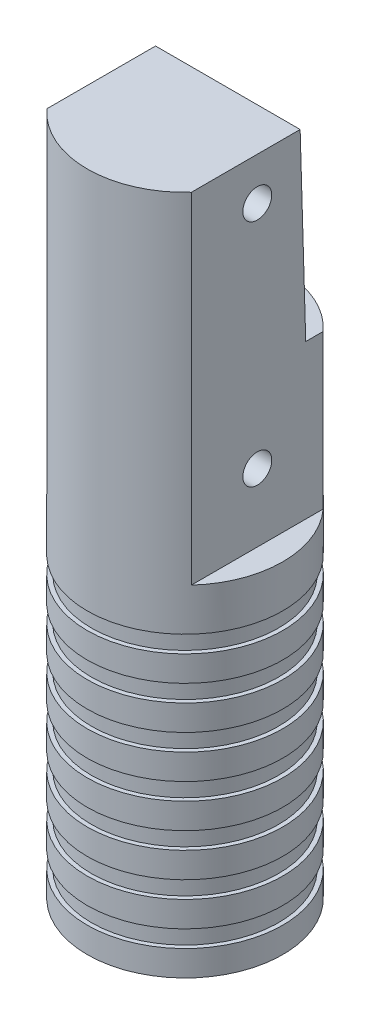
ISO-10303-21;
HEADER;
FILE_DESCRIPTION(('STEP AP214'),'2;1');
FILE_NAME('part.step','',(''),(''),'','','');
FILE_SCHEMA(('AUTOMOTIVE_DESIGN { 1 0 10303 214 1 1 1 1 }'));
ENDSEC;
DATA;
#1=APPLICATION_CONTEXT('core data for automotive mechanical design processes');
#2=APPLICATION_PROTOCOL_DEFINITION('international standard','automotive_design',2000,#1);
#3=PRODUCT_CONTEXT('',#1,'mechanical');
#4=PRODUCT('Part','Part','',(#3));
#5=PRODUCT_RELATED_PRODUCT_CATEGORY('part','',(#4));
#6=PRODUCT_DEFINITION_FORMATION('','',#4);
#7=PRODUCT_DEFINITION_CONTEXT('part definition',#1,'design');
#8=PRODUCT_DEFINITION('design','',#6,#7);
#9=PRODUCT_DEFINITION_SHAPE('','',#8);
#10=(LENGTH_UNIT() NAMED_UNIT(*) SI_UNIT(.MILLI.,.METRE.));
#11=(NAMED_UNIT(*) PLANE_ANGLE_UNIT() SI_UNIT($,.RADIAN.));
#12=(NAMED_UNIT(*) SI_UNIT($,.STERADIAN.) SOLID_ANGLE_UNIT());
#13=UNCERTAINTY_MEASURE_WITH_UNIT(LENGTH_MEASURE(1.E-05),#10,'distance_accuracy_value','');
#14=(GEOMETRIC_REPRESENTATION_CONTEXT(3) GLOBAL_UNCERTAINTY_ASSIGNED_CONTEXT((#13)) GLOBAL_UNIT_ASSIGNED_CONTEXT((#10,
#11,#12)) REPRESENTATION_CONTEXT('',''));
#15=CARTESIAN_POINT('',(0.,0.,0.));
#16=DIRECTION('',(0.,0.,1.));
#17=DIRECTION('',(1.,0.,0.));
#18=AXIS2_PLACEMENT_3D('',#15,#16,#17);
#19=CARTESIAN_POINT('',(8.5,40.,-7.74596669241483));
#20=DIRECTION('',(-1.,0.,0.));
#21=DIRECTION('',(0.,0.,1.));
#22=AXIS2_PLACEMENT_3D('',#19,#20,#21);
#23=PLANE('',#22);
#24=CARTESIAN_POINT('',(8.5,8.,0.));
#25=DIRECTION('',(1.,0.,0.));
#26=DIRECTION('',(0.,0.,-1.));
#27=AXIS2_PLACEMENT_3D('',#24,#25,#26);
#28=CIRCLE('',#27,1.69999999999999);
#29=CARTESIAN_POINT('',(8.5,8.,-1.69999999999999));
#30=VERTEX_POINT('',#29);
#31=EDGE_CURVE('E129',#30,#30,#28,.T.);
#32=ORIENTED_EDGE('',*,*,#31,.F.);
#33=EDGE_LOOP('',(#32));
#34=FACE_BOUND('',#33,.T.);
#35=DIRECTION('',(0.,-1.,0.));
#36=VECTOR('',#35,1.);
#37=CARTESIAN_POINT('',(8.5,40.,-7.74596669241483));
#38=LINE('',#37,#36);
#39=CARTESIAN_POINT('',(8.5,18.0816446814,-7.74596669241483));
#40=VERTEX_POINT('',#39);
#41=CARTESIAN_POINT('',(8.49999999999999,0.,-7.74596669241484));
#42=VERTEX_POINT('',#41);
#43=EDGE_CURVE('E156',#40,#42,#38,.T.);
#44=ORIENTED_EDGE('',*,*,#43,.F.);
#45=DIRECTION('',(0.,0.,1.));
#46=VECTOR('',#45,1.);
#47=CARTESIAN_POINT('',(8.5,18.0816446814,-7.74596669241483));
#48=LINE('',#47,#46);
#49=CARTESIAN_POINT('',(8.5,18.0816446814,-5.69544109983987));
#50=VERTEX_POINT('',#49);
#51=EDGE_CURVE('E127',#40,#50,#48,.T.);
#52=ORIENTED_EDGE('',*,*,#51,.T.);
#53=DIRECTION('',(0.,0.999550081494303,0.0299939091272407));
#54=VECTOR('',#53,1.);
#55=CARTESIAN_POINT('',(8.5,39.9188058826912,-5.04016445008036));
#56=LINE('',#55,#54);
#57=CARTESIAN_POINT('',(8.5,40.,-5.03772802491136));
#58=VERTEX_POINT('',#57);
#59=EDGE_CURVE('E117',#50,#58,#56,.T.);
#60=ORIENTED_EDGE('',*,*,#59,.T.);
#61=DIRECTION('',(0.,0.,-1.));
#62=VECTOR('',#61,1.);
#63=CARTESIAN_POINT('',(8.5,40.,-7.74596669241483));
#64=LINE('',#63,#62);
#65=CARTESIAN_POINT('',(8.5,40.,7.74596669241483));
#66=VERTEX_POINT('',#65);
#67=EDGE_CURVE('E153',#66,#58,#64,.T.);
#68=ORIENTED_EDGE('',*,*,#67,.F.);
#69=DIRECTION('',(0.,-1.,0.));
#70=VECTOR('',#69,1.);
#71=CARTESIAN_POINT('',(8.5,40.,7.74596669241483));
#72=LINE('',#71,#70);
#73=CARTESIAN_POINT('',(8.49999999999999,0.,7.74596669241484));
#74=VERTEX_POINT('',#73);
#75=EDGE_CURVE('E162',#66,#74,#72,.T.);
#76=ORIENTED_EDGE('',*,*,#75,.T.);
#77=DIRECTION('',(0.,0.,-1.));
#78=VECTOR('',#77,1.);
#79=CARTESIAN_POINT('',(8.5,0.,-7.74596669241483));
#80=LINE('',#79,#78);
#81=EDGE_CURVE('E151',#74,#42,#80,.T.);
#82=ORIENTED_EDGE('',*,*,#81,.T.);
#83=EDGE_LOOP('',(#44,#52,#60,#68,#76,#82));
#84=FACE_BOUND('',#83,.T.);
#85=CARTESIAN_POINT('',(8.5,35.,0.));
#86=DIRECTION('',(1.,0.,0.));
#87=DIRECTION('',(0.,0.,-1.));
#88=AXIS2_PLACEMENT_3D('',#85,#86,#87);
#89=CIRCLE('',#88,1.69999999999999);
#90=CARTESIAN_POINT('',(8.5,35.,-1.69999999999999));
#91=VERTEX_POINT('',#90);
#92=EDGE_CURVE('E135',#91,#91,#89,.T.);
#93=ORIENTED_EDGE('',*,*,#92,.F.);
#94=EDGE_LOOP('',(#93));
#95=FACE_BOUND('',#94,.T.);
#96=ADVANCED_FACE('F53',(#34,#84,#95),#23,.F.);
#97=CARTESIAN_POINT('',(0.,0.,0.));
#98=DIRECTION('',(0.,-1.,0.));
#99=DIRECTION('',(0.,0.,-1.));
#100=AXIS2_PLACEMENT_3D('',#97,#98,#99);
#101=PLANE('',#100);
#102=ORIENTED_EDGE('',*,*,#81,.F.);
#103=CARTESIAN_POINT('',(0.,0.,0.));
#104=DIRECTION('',(0.,1.,0.));
#105=DIRECTION('',(0.,0.,1.));
#106=AXIS2_PLACEMENT_3D('',#103,#104,#105);
#107=CIRCLE('',#106,11.5);
#108=EDGE_CURVE('E257',#74,#42,#107,.T.);
#109=ORIENTED_EDGE('',*,*,#108,.T.);
#110=EDGE_LOOP('',(#102,#109));
#111=FACE_BOUND('',#110,.T.);
#112=ADVANCED_FACE('F55',(#111),#101,.F.);
#113=DIRECTION('',(0.,0.,1.));
#114=VECTOR('',#113,1.);
#115=CARTESIAN_POINT('',(-8.5,0.,-7.74596669241483));
#116=LINE('',#115,#114);
#117=CARTESIAN_POINT('',(-8.49999999999999,0.,-7.74596669241484));
#118=VERTEX_POINT('',#117);
#119=CARTESIAN_POINT('',(-8.5,0.,7.74596669241483));
#120=VERTEX_POINT('',#119);
#121=EDGE_CURVE('E148',#118,#120,#116,.T.);
#122=ORIENTED_EDGE('',*,*,#121,.F.);
#123=EDGE_CURVE('E256',#118,#120,#107,.T.);
#124=ORIENTED_EDGE('',*,*,#123,.T.);
#125=EDGE_LOOP('',(#122,#124));
#126=FACE_BOUND('',#125,.T.);
#127=ADVANCED_FACE('F277',(#126),#101,.F.);
#128=CARTESIAN_POINT('',(0.,0.,0.));
#129=DIRECTION('',(0.,1.,0.));
#130=DIRECTION('',(0.,0.,1.));
#131=AXIS2_PLACEMENT_3D('',#128,#129,#130);
#132=CYLINDRICAL_SURFACE('',#131,11.5);
#133=CARTESIAN_POINT('',(0.,-7.,0.));
#134=DIRECTION('',(0.,1.,0.));
#135=DIRECTION('',(0.,0.,1.));
#136=AXIS2_PLACEMENT_3D('',#133,#134,#135);
#137=CIRCLE('',#136,11.5);
#138=CARTESIAN_POINT('',(0.,-7.,11.5));
#139=VERTEX_POINT('',#138);
#140=EDGE_CURVE('E178',#139,#139,#137,.T.);
#141=ORIENTED_EDGE('',*,*,#140,.F.);
#142=EDGE_LOOP('',(#141));
#143=FACE_BOUND('',#142,.T.);
#144=CARTESIAN_POINT('',(0.,-9.99999999999999,0.));
#145=DIRECTION('',(0.,1.,0.));
#146=DIRECTION('',(0.,0.,1.));
#147=AXIS2_PLACEMENT_3D('',#144,#145,#146);
#148=CIRCLE('',#147,11.5);
#149=CARTESIAN_POINT('',(0.,-9.99999999999999,11.5));
#150=VERTEX_POINT('',#149);
#151=EDGE_CURVE('E181',#150,#150,#148,.T.);
#152=ORIENTED_EDGE('',*,*,#151,.T.);
#153=EDGE_LOOP('',(#152));
#154=FACE_BOUND('',#153,.T.);
#155=ADVANCED_FACE('F282',(#143,#154),#132,.T.);
#156=CARTESIAN_POINT('',(0.,-12.,0.));
#157=DIRECTION('',(0.,1.,0.));
#158=DIRECTION('',(0.,0.,1.));
#159=AXIS2_PLACEMENT_3D('',#156,#157,#158);
#160=CIRCLE('',#159,11.5);
#161=CARTESIAN_POINT('',(0.,-12.,11.5));
#162=VERTEX_POINT('',#161);
#163=EDGE_CURVE('E190',#162,#162,#160,.T.);
#164=ORIENTED_EDGE('',*,*,#163,.F.);
#165=EDGE_LOOP('',(#164));
#166=FACE_BOUND('',#165,.T.);
#167=CARTESIAN_POINT('',(0.,-15.,0.));
#168=DIRECTION('',(0.,1.,0.));
#169=DIRECTION('',(0.,0.,1.));
#170=AXIS2_PLACEMENT_3D('',#167,#168,#169);
#171=CIRCLE('',#170,11.5);
#172=CARTESIAN_POINT('',(0.,-15.,11.5));
#173=VERTEX_POINT('',#172);
#174=EDGE_CURVE('E193',#173,#173,#171,.T.);
#175=ORIENTED_EDGE('',*,*,#174,.T.);
#176=EDGE_LOOP('',(#175));
#177=FACE_BOUND('',#176,.T.);
#178=ADVANCED_FACE('F390',(#166,#177),#132,.T.);
#179=CARTESIAN_POINT('',(0.,-17.,0.));
#180=DIRECTION('',(0.,1.,0.));
#181=DIRECTION('',(0.,0.,1.));
#182=AXIS2_PLACEMENT_3D('',#179,#180,#181);
#183=CIRCLE('',#182,11.5);
#184=CARTESIAN_POINT('',(0.,-17.,11.5));
#185=VERTEX_POINT('',#184);
#186=EDGE_CURVE('E202',#185,#185,#183,.T.);
#187=ORIENTED_EDGE('',*,*,#186,.F.);
#188=EDGE_LOOP('',(#187));
#189=FACE_BOUND('',#188,.T.);
#190=CARTESIAN_POINT('',(0.,-20.,0.));
#191=DIRECTION('',(0.,1.,0.));
#192=DIRECTION('',(0.,0.,1.));
#193=AXIS2_PLACEMENT_3D('',#190,#191,#192);
#194=CIRCLE('',#193,11.5);
#195=CARTESIAN_POINT('',(0.,-20.,11.5));
#196=VERTEX_POINT('',#195);
#197=EDGE_CURVE('E205',#196,#196,#194,.T.);
#198=ORIENTED_EDGE('',*,*,#197,.T.);
#199=EDGE_LOOP('',(#198));
#200=FACE_BOUND('',#199,.T.);
#201=ADVANCED_FACE('F422',(#189,#200),#132,.T.);
#202=CARTESIAN_POINT('',(0.,-22.,0.));
#203=DIRECTION('',(0.,1.,0.));
#204=DIRECTION('',(0.,0.,1.));
#205=AXIS2_PLACEMENT_3D('',#202,#203,#204);
#206=CIRCLE('',#205,11.5);
#207=CARTESIAN_POINT('',(0.,-22.,11.5));
#208=VERTEX_POINT('',#207);
#209=EDGE_CURVE('E214',#208,#208,#206,.T.);
#210=ORIENTED_EDGE('',*,*,#209,.F.);
#211=EDGE_LOOP('',(#210));
#212=FACE_BOUND('',#211,.T.);
#213=CARTESIAN_POINT('',(0.,-25.,0.));
#214=DIRECTION('',(0.,1.,0.));
#215=DIRECTION('',(0.,0.,1.));
#216=AXIS2_PLACEMENT_3D('',#213,#214,#215);
#217=CIRCLE('',#216,11.5);
#218=CARTESIAN_POINT('',(0.,-25.,11.5));
#219=VERTEX_POINT('',#218);
#220=EDGE_CURVE('E217',#219,#219,#217,.T.);
#221=ORIENTED_EDGE('',*,*,#220,.T.);
#222=EDGE_LOOP('',(#221));
#223=FACE_BOUND('',#222,.T.);
#224=ADVANCED_FACE('F409',(#212,#223),#132,.T.);
#225=CARTESIAN_POINT('',(0.,-27.,0.));
#226=DIRECTION('',(0.,1.,0.));
#227=DIRECTION('',(0.,0.,1.));
#228=AXIS2_PLACEMENT_3D('',#225,#226,#227);
#229=CIRCLE('',#228,11.5);
#230=CARTESIAN_POINT('',(0.,-27.,11.5));
#231=VERTEX_POINT('',#230);
#232=EDGE_CURVE('E226',#231,#231,#229,.T.);
#233=ORIENTED_EDGE('',*,*,#232,.F.);
#234=EDGE_LOOP('',(#233));
#235=FACE_BOUND('',#234,.T.);
#236=CARTESIAN_POINT('',(0.,-30.,0.));
#237=DIRECTION('',(0.,1.,0.));
#238=DIRECTION('',(0.,0.,1.));
#239=AXIS2_PLACEMENT_3D('',#236,#237,#238);
#240=CIRCLE('',#239,11.5);
#241=CARTESIAN_POINT('',(0.,-30.,11.5));
#242=VERTEX_POINT('',#241);
#243=EDGE_CURVE('E229',#242,#242,#240,.T.);
#244=ORIENTED_EDGE('',*,*,#243,.T.);
#245=EDGE_LOOP('',(#244));
#246=FACE_BOUND('',#245,.T.);
#247=ADVANCED_FACE('F398',(#235,#246),#132,.T.);
#248=CARTESIAN_POINT('',(0.,-32.,0.));
#249=DIRECTION('',(0.,1.,0.));
#250=DIRECTION('',(0.,0.,1.));
#251=AXIS2_PLACEMENT_3D('',#248,#249,#250);
#252=CIRCLE('',#251,11.5);
#253=CARTESIAN_POINT('',(0.,-32.,11.5));
#254=VERTEX_POINT('',#253);
#255=EDGE_CURVE('E238',#254,#254,#252,.T.);
#256=ORIENTED_EDGE('',*,*,#255,.F.);
#257=EDGE_LOOP('',(#256));
#258=FACE_BOUND('',#257,.T.);
#259=CARTESIAN_POINT('',(0.,-35.,0.));
#260=DIRECTION('',(0.,1.,0.));
#261=DIRECTION('',(0.,0.,1.));
#262=AXIS2_PLACEMENT_3D('',#259,#260,#261);
#263=CIRCLE('',#262,11.5);
#264=CARTESIAN_POINT('',(0.,-35.,11.5));
#265=VERTEX_POINT('',#264);
#266=EDGE_CURVE('E241',#265,#265,#263,.T.);
#267=ORIENTED_EDGE('',*,*,#266,.T.);
#268=EDGE_LOOP('',(#267));
#269=FACE_BOUND('',#268,.T.);
#270=ADVANCED_FACE('F393',(#258,#269),#132,.T.);
#271=CARTESIAN_POINT('',(0.,-37.,0.));
#272=DIRECTION('',(0.,1.,0.));
#273=DIRECTION('',(0.,0.,1.));
#274=AXIS2_PLACEMENT_3D('',#271,#272,#273);
#275=CIRCLE('',#274,11.5);
#276=CARTESIAN_POINT('',(0.,-37.,11.5));
#277=VERTEX_POINT('',#276);
#278=EDGE_CURVE('E250',#277,#277,#275,.T.);
#279=ORIENTED_EDGE('',*,*,#278,.F.);
#280=EDGE_LOOP('',(#279));
#281=FACE_BOUND('',#280,.T.);
#282=CARTESIAN_POINT('',(0.,-40.,0.));
#283=DIRECTION('',(0.,1.,0.));
#284=DIRECTION('',(0.,0.,1.));
#285=AXIS2_PLACEMENT_3D('',#282,#283,#284);
#286=CIRCLE('',#285,11.5);
#287=CARTESIAN_POINT('',(0.,-40.,11.5));
#288=VERTEX_POINT('',#287);
#289=EDGE_CURVE('E253',#288,#288,#286,.T.);
#290=ORIENTED_EDGE('',*,*,#289,.T.);
#291=EDGE_LOOP('',(#290));
#292=FACE_BOUND('',#291,.T.);
#293=ADVANCED_FACE('F384',(#281,#292),#132,.T.);
#294=CARTESIAN_POINT('',(0.,-40.,0.));
#295=DIRECTION('',(0.,-1.,0.));
#296=DIRECTION('',(0.,0.,-1.));
#297=AXIS2_PLACEMENT_3D('',#294,#295,#296);
#298=PLANE('',#297);
#299=CARTESIAN_POINT('',(0.,-40.,0.));
#300=DIRECTION('',(0.,-1.,0.));
#301=DIRECTION('',(0.,0.,-1.));
#302=AXIS2_PLACEMENT_3D('',#299,#300,#301);
#303=CIRCLE('',#302,7.49999999999999);
#304=CARTESIAN_POINT('',(0.,-40.,-7.49999999999999));
#305=VERTEX_POINT('',#304);
#306=EDGE_CURVE('E142',#305,#305,#303,.T.);
#307=ORIENTED_EDGE('',*,*,#306,.F.);
#308=EDGE_LOOP('',(#307));
#309=FACE_BOUND('',#308,.T.);
#310=ORIENTED_EDGE('',*,*,#289,.F.);
#311=EDGE_LOOP('',(#310));
#312=FACE_BOUND('',#311,.T.);
#313=ADVANCED_FACE('F381',(#309,#312),#298,.T.);
#314=CARTESIAN_POINT('',(11.5,-37.,0.));
#315=DIRECTION('',(0.,-1.,0.));
#316=DIRECTION('',(0.,0.,-1.));
#317=AXIS2_PLACEMENT_3D('',#314,#315,#316);
#318=PLANE('',#317);
#319=CARTESIAN_POINT('',(0.,-37.,0.));
#320=DIRECTION('',(0.,1.,0.));
#321=DIRECTION('',(0.,0.,1.));
#322=AXIS2_PLACEMENT_3D('',#319,#320,#321);
#323=CIRCLE('',#322,11.);
#324=CARTESIAN_POINT('',(0.,-37.,11.));
#325=VERTEX_POINT('',#324);
#326=EDGE_CURVE('E247',#325,#325,#323,.T.);
#327=ORIENTED_EDGE('',*,*,#326,.F.);
#328=EDGE_LOOP('',(#327));
#329=FACE_BOUND('',#328,.T.);
#330=ORIENTED_EDGE('',*,*,#278,.T.);
#331=EDGE_LOOP('',(#330));
#332=FACE_BOUND('',#331,.T.);
#333=ADVANCED_FACE('F377',(#329,#332),#318,.F.);
#334=CARTESIAN_POINT('',(0.,0.,0.));
#335=DIRECTION('',(0.,1.,0.));
#336=DIRECTION('',(0.,0.,1.));
#337=AXIS2_PLACEMENT_3D('',#334,#335,#336);
#338=CYLINDRICAL_SURFACE('',#337,11.);
#339=CARTESIAN_POINT('',(0.,-35.,0.));
#340=DIRECTION('',(0.,1.,0.));
#341=DIRECTION('',(0.,0.,1.));
#342=AXIS2_PLACEMENT_3D('',#339,#340,#341);
#343=CIRCLE('',#342,11.);
#344=CARTESIAN_POINT('',(0.,-35.,11.));
#345=VERTEX_POINT('',#344);
#346=EDGE_CURVE('E244',#345,#345,#343,.T.);
#347=ORIENTED_EDGE('',*,*,#346,.F.);
#348=EDGE_LOOP('',(#347));
#349=FACE_BOUND('',#348,.T.);
#350=ORIENTED_EDGE('',*,*,#326,.T.);
#351=EDGE_LOOP('',(#350));
#352=FACE_BOUND('',#351,.T.);
#353=ADVANCED_FACE('F373',(#349,#352),#338,.T.);
#354=CARTESIAN_POINT('',(11.,-35.,0.));
#355=DIRECTION('',(0.,1.,0.));
#356=DIRECTION('',(0.,0.,1.));
#357=AXIS2_PLACEMENT_3D('',#354,#355,#356);
#358=PLANE('',#357);
#359=ORIENTED_EDGE('',*,*,#266,.F.);
#360=EDGE_LOOP('',(#359));
#361=FACE_BOUND('',#360,.T.);
#362=ORIENTED_EDGE('',*,*,#346,.T.);
#363=EDGE_LOOP('',(#362));
#364=FACE_BOUND('',#363,.T.);
#365=ADVANCED_FACE('F369',(#361,#364),#358,.F.);
#366=CARTESIAN_POINT('',(11.5,-32.,0.));
#367=DIRECTION('',(0.,-1.,0.));
#368=DIRECTION('',(0.,0.,-1.));
#369=AXIS2_PLACEMENT_3D('',#366,#367,#368);
#370=PLANE('',#369);
#371=CARTESIAN_POINT('',(0.,-32.,0.));
#372=DIRECTION('',(0.,1.,0.));
#373=DIRECTION('',(0.,0.,1.));
#374=AXIS2_PLACEMENT_3D('',#371,#372,#373);
#375=CIRCLE('',#374,11.);
#376=CARTESIAN_POINT('',(0.,-32.,11.));
#377=VERTEX_POINT('',#376);
#378=EDGE_CURVE('E235',#377,#377,#375,.T.);
#379=ORIENTED_EDGE('',*,*,#378,.F.);
#380=EDGE_LOOP('',(#379));
#381=FACE_BOUND('',#380,.T.);
#382=ORIENTED_EDGE('',*,*,#255,.T.);
#383=EDGE_LOOP('',(#382));
#384=FACE_BOUND('',#383,.T.);
#385=ADVANCED_FACE('F365',(#381,#384),#370,.F.);
#386=CARTESIAN_POINT('',(0.,5.,0.));
#387=DIRECTION('',(0.,1.,0.));
#388=DIRECTION('',(0.,0.,1.));
#389=AXIS2_PLACEMENT_3D('',#386,#387,#388);
#390=CYLINDRICAL_SURFACE('',#389,11.);
#391=CARTESIAN_POINT('',(0.,-30.,0.));
#392=DIRECTION('',(0.,1.,0.));
#393=DIRECTION('',(0.,0.,1.));
#394=AXIS2_PLACEMENT_3D('',#391,#392,#393);
#395=CIRCLE('',#394,11.);
#396=CARTESIAN_POINT('',(0.,-30.,11.));
#397=VERTEX_POINT('',#396);
#398=EDGE_CURVE('E232',#397,#397,#395,.T.);
#399=ORIENTED_EDGE('',*,*,#398,.F.);
#400=EDGE_LOOP('',(#399));
#401=FACE_BOUND('',#400,.T.);
#402=ORIENTED_EDGE('',*,*,#378,.T.);
#403=EDGE_LOOP('',(#402));
#404=FACE_BOUND('',#403,.T.);
#405=ADVANCED_FACE('F361',(#401,#404),#390,.T.);
#406=CARTESIAN_POINT('',(11.,-30.,0.));
#407=DIRECTION('',(0.,1.,0.));
#408=DIRECTION('',(0.,0.,1.));
#409=AXIS2_PLACEMENT_3D('',#406,#407,#408);
#410=PLANE('',#409);
#411=ORIENTED_EDGE('',*,*,#243,.F.);
#412=EDGE_LOOP('',(#411));
#413=FACE_BOUND('',#412,.T.);
#414=ORIENTED_EDGE('',*,*,#398,.T.);
#415=EDGE_LOOP('',(#414));
#416=FACE_BOUND('',#415,.T.);
#417=ADVANCED_FACE('F357',(#413,#416),#410,.F.);
#418=CARTESIAN_POINT('',(11.5,-27.,0.));
#419=DIRECTION('',(0.,-1.,0.));
#420=DIRECTION('',(0.,0.,-1.));
#421=AXIS2_PLACEMENT_3D('',#418,#419,#420);
#422=PLANE('',#421);
#423=CARTESIAN_POINT('',(0.,-27.,0.));
#424=DIRECTION('',(0.,1.,0.));
#425=DIRECTION('',(0.,0.,1.));
#426=AXIS2_PLACEMENT_3D('',#423,#424,#425);
#427=CIRCLE('',#426,11.);
#428=CARTESIAN_POINT('',(0.,-27.,11.));
#429=VERTEX_POINT('',#428);
#430=EDGE_CURVE('E223',#429,#429,#427,.T.);
#431=ORIENTED_EDGE('',*,*,#430,.F.);
#432=EDGE_LOOP('',(#431));
#433=FACE_BOUND('',#432,.T.);
#434=ORIENTED_EDGE('',*,*,#232,.T.);
#435=EDGE_LOOP('',(#434));
#436=FACE_BOUND('',#435,.T.);
#437=ADVANCED_FACE('F353',(#433,#436),#422,.F.);
#438=CARTESIAN_POINT('',(0.,10.,0.));
#439=DIRECTION('',(0.,1.,0.));
#440=DIRECTION('',(0.,0.,1.));
#441=AXIS2_PLACEMENT_3D('',#438,#439,#440);
#442=CYLINDRICAL_SURFACE('',#441,11.);
#443=CARTESIAN_POINT('',(0.,-25.,0.));
#444=DIRECTION('',(0.,1.,0.));
#445=DIRECTION('',(0.,0.,1.));
#446=AXIS2_PLACEMENT_3D('',#443,#444,#445);
#447=CIRCLE('',#446,11.);
#448=CARTESIAN_POINT('',(0.,-25.,11.));
#449=VERTEX_POINT('',#448);
#450=EDGE_CURVE('E220',#449,#449,#447,.T.);
#451=ORIENTED_EDGE('',*,*,#450,.F.);
#452=EDGE_LOOP('',(#451));
#453=FACE_BOUND('',#452,.T.);
#454=ORIENTED_EDGE('',*,*,#430,.T.);
#455=EDGE_LOOP('',(#454));
#456=FACE_BOUND('',#455,.T.);
#457=ADVANCED_FACE('F349',(#453,#456),#442,.T.);
#458=CARTESIAN_POINT('',(11.,-25.,0.));
#459=DIRECTION('',(0.,1.,0.));
#460=DIRECTION('',(0.,0.,1.));
#461=AXIS2_PLACEMENT_3D('',#458,#459,#460);
#462=PLANE('',#461);
#463=ORIENTED_EDGE('',*,*,#220,.F.);
#464=EDGE_LOOP('',(#463));
#465=FACE_BOUND('',#464,.T.);
#466=ORIENTED_EDGE('',*,*,#450,.T.);
#467=EDGE_LOOP('',(#466));
#468=FACE_BOUND('',#467,.T.);
#469=ADVANCED_FACE('F345',(#465,#468),#462,.F.);
#470=CARTESIAN_POINT('',(11.5,-22.,0.));
#471=DIRECTION('',(0.,-1.,0.));
#472=DIRECTION('',(0.,0.,-1.));
#473=AXIS2_PLACEMENT_3D('',#470,#471,#472);
#474=PLANE('',#473);
#475=CARTESIAN_POINT('',(0.,-22.,0.));
#476=DIRECTION('',(0.,1.,0.));
#477=DIRECTION('',(0.,0.,1.));
#478=AXIS2_PLACEMENT_3D('',#475,#476,#477);
#479=CIRCLE('',#478,11.);
#480=CARTESIAN_POINT('',(0.,-22.,11.));
#481=VERTEX_POINT('',#480);
#482=EDGE_CURVE('E211',#481,#481,#479,.T.);
#483=ORIENTED_EDGE('',*,*,#482,.F.);
#484=EDGE_LOOP('',(#483));
#485=FACE_BOUND('',#484,.T.);
#486=ORIENTED_EDGE('',*,*,#209,.T.);
#487=EDGE_LOOP('',(#486));
#488=FACE_BOUND('',#487,.T.);
#489=ADVANCED_FACE('F341',(#485,#488),#474,.F.);
#490=CARTESIAN_POINT('',(0.,15.,0.));
#491=DIRECTION('',(0.,1.,0.));
#492=DIRECTION('',(0.,0.,1.));
#493=AXIS2_PLACEMENT_3D('',#490,#491,#492);
#494=CYLINDRICAL_SURFACE('',#493,11.);
#495=CARTESIAN_POINT('',(0.,-20.,0.));
#496=DIRECTION('',(0.,1.,0.));
#497=DIRECTION('',(0.,0.,1.));
#498=AXIS2_PLACEMENT_3D('',#495,#496,#497);
#499=CIRCLE('',#498,11.);
#500=CARTESIAN_POINT('',(0.,-20.,11.));
#501=VERTEX_POINT('',#500);
#502=EDGE_CURVE('E208',#501,#501,#499,.T.);
#503=ORIENTED_EDGE('',*,*,#502,.F.);
#504=EDGE_LOOP('',(#503));
#505=FACE_BOUND('',#504,.T.);
#506=ORIENTED_EDGE('',*,*,#482,.T.);
#507=EDGE_LOOP('',(#506));
#508=FACE_BOUND('',#507,.T.);
#509=ADVANCED_FACE('F337',(#505,#508),#494,.T.);
#510=CARTESIAN_POINT('',(11.,-20.,0.));
#511=DIRECTION('',(0.,1.,0.));
#512=DIRECTION('',(0.,0.,1.));
#513=AXIS2_PLACEMENT_3D('',#510,#511,#512);
#514=PLANE('',#513);
#515=ORIENTED_EDGE('',*,*,#197,.F.);
#516=EDGE_LOOP('',(#515));
#517=FACE_BOUND('',#516,.T.);
#518=ORIENTED_EDGE('',*,*,#502,.T.);
#519=EDGE_LOOP('',(#518));
#520=FACE_BOUND('',#519,.T.);
#521=ADVANCED_FACE('F333',(#517,#520),#514,.F.);
#522=CARTESIAN_POINT('',(11.5,-17.,0.));
#523=DIRECTION('',(0.,-1.,0.));
#524=DIRECTION('',(0.,0.,-1.));
#525=AXIS2_PLACEMENT_3D('',#522,#523,#524);
#526=PLANE('',#525);
#527=CARTESIAN_POINT('',(0.,-17.,0.));
#528=DIRECTION('',(0.,1.,0.));
#529=DIRECTION('',(0.,0.,1.));
#530=AXIS2_PLACEMENT_3D('',#527,#528,#529);
#531=CIRCLE('',#530,11.);
#532=CARTESIAN_POINT('',(0.,-17.,11.));
#533=VERTEX_POINT('',#532);
#534=EDGE_CURVE('E199',#533,#533,#531,.T.);
#535=ORIENTED_EDGE('',*,*,#534,.F.);
#536=EDGE_LOOP('',(#535));
#537=FACE_BOUND('',#536,.T.);
#538=ORIENTED_EDGE('',*,*,#186,.T.);
#539=EDGE_LOOP('',(#538));
#540=FACE_BOUND('',#539,.T.);
#541=ADVANCED_FACE('F329',(#537,#540),#526,.F.);
#542=CARTESIAN_POINT('',(0.,20.,0.));
#543=DIRECTION('',(0.,1.,0.));
#544=DIRECTION('',(0.,0.,1.));
#545=AXIS2_PLACEMENT_3D('',#542,#543,#544);
#546=CYLINDRICAL_SURFACE('',#545,11.);
#547=CARTESIAN_POINT('',(0.,-15.,0.));
#548=DIRECTION('',(0.,1.,0.));
#549=DIRECTION('',(0.,0.,1.));
#550=AXIS2_PLACEMENT_3D('',#547,#548,#549);
#551=CIRCLE('',#550,11.);
#552=CARTESIAN_POINT('',(0.,-15.,11.));
#553=VERTEX_POINT('',#552);
#554=EDGE_CURVE('E196',#553,#553,#551,.T.);
#555=ORIENTED_EDGE('',*,*,#554,.F.);
#556=EDGE_LOOP('',(#555));
#557=FACE_BOUND('',#556,.T.);
#558=ORIENTED_EDGE('',*,*,#534,.T.);
#559=EDGE_LOOP('',(#558));
#560=FACE_BOUND('',#559,.T.);
#561=ADVANCED_FACE('F325',(#557,#560),#546,.T.);
#562=CARTESIAN_POINT('',(11.,-15.,0.));
#563=DIRECTION('',(0.,1.,0.));
#564=DIRECTION('',(0.,0.,1.));
#565=AXIS2_PLACEMENT_3D('',#562,#563,#564);
#566=PLANE('',#565);
#567=ORIENTED_EDGE('',*,*,#174,.F.);
#568=EDGE_LOOP('',(#567));
#569=FACE_BOUND('',#568,.T.);
#570=ORIENTED_EDGE('',*,*,#554,.T.);
#571=EDGE_LOOP('',(#570));
#572=FACE_BOUND('',#571,.T.);
#573=ADVANCED_FACE('F321',(#569,#572),#566,.F.);
#574=CARTESIAN_POINT('',(11.5,-12.,0.));
#575=DIRECTION('',(0.,-1.,0.));
#576=DIRECTION('',(0.,0.,-1.));
#577=AXIS2_PLACEMENT_3D('',#574,#575,#576);
#578=PLANE('',#577);
#579=CARTESIAN_POINT('',(0.,-12.,0.));
#580=DIRECTION('',(0.,1.,0.));
#581=DIRECTION('',(0.,0.,1.));
#582=AXIS2_PLACEMENT_3D('',#579,#580,#581);
#583=CIRCLE('',#582,11.);
#584=CARTESIAN_POINT('',(0.,-12.,11.));
#585=VERTEX_POINT('',#584);
#586=EDGE_CURVE('E187',#585,#585,#583,.T.);
#587=ORIENTED_EDGE('',*,*,#586,.F.);
#588=EDGE_LOOP('',(#587));
#589=FACE_BOUND('',#588,.T.);
#590=ORIENTED_EDGE('',*,*,#163,.T.);
#591=EDGE_LOOP('',(#590));
#592=FACE_BOUND('',#591,.T.);
#593=ADVANCED_FACE('F317',(#589,#592),#578,.F.);
#594=CARTESIAN_POINT('',(0.,25.,0.));
#595=DIRECTION('',(0.,1.,0.));
#596=DIRECTION('',(0.,0.,1.));
#597=AXIS2_PLACEMENT_3D('',#594,#595,#596);
#598=CYLINDRICAL_SURFACE('',#597,11.);
#599=CARTESIAN_POINT('',(0.,-9.99999999999999,0.));
#600=DIRECTION('',(0.,1.,0.));
#601=DIRECTION('',(0.,0.,1.));
#602=AXIS2_PLACEMENT_3D('',#599,#600,#601);
#603=CIRCLE('',#602,11.);
#604=CARTESIAN_POINT('',(0.,-9.99999999999999,11.));
#605=VERTEX_POINT('',#604);
#606=EDGE_CURVE('E184',#605,#605,#603,.T.);
#607=ORIENTED_EDGE('',*,*,#606,.F.);
#608=EDGE_LOOP('',(#607));
#609=FACE_BOUND('',#608,.T.);
#610=ORIENTED_EDGE('',*,*,#586,.T.);
#611=EDGE_LOOP('',(#610));
#612=FACE_BOUND('',#611,.T.);
#613=ADVANCED_FACE('F313',(#609,#612),#598,.T.);
#614=CARTESIAN_POINT('',(11.,-9.99999999999999,0.));
#615=DIRECTION('',(0.,1.,0.));
#616=DIRECTION('',(0.,0.,1.));
#617=AXIS2_PLACEMENT_3D('',#614,#615,#616);
#618=PLANE('',#617);
#619=ORIENTED_EDGE('',*,*,#151,.F.);
#620=EDGE_LOOP('',(#619));
#621=FACE_BOUND('',#620,.T.);
#622=ORIENTED_EDGE('',*,*,#606,.T.);
#623=EDGE_LOOP('',(#622));
#624=FACE_BOUND('',#623,.T.);
#625=ADVANCED_FACE('F309',(#621,#624),#618,.F.);
#626=CARTESIAN_POINT('',(11.5,-7.,0.));
#627=DIRECTION('',(0.,-1.,0.));
#628=DIRECTION('',(0.,0.,-1.));
#629=AXIS2_PLACEMENT_3D('',#626,#627,#628);
#630=PLANE('',#629);
#631=CARTESIAN_POINT('',(0.,-7.,0.));
#632=DIRECTION('',(0.,1.,0.));
#633=DIRECTION('',(0.,0.,1.));
#634=AXIS2_PLACEMENT_3D('',#631,#632,#633);
#635=CIRCLE('',#634,11.);
#636=CARTESIAN_POINT('',(0.,-7.,11.));
#637=VERTEX_POINT('',#636);
#638=EDGE_CURVE('E175',#637,#637,#635,.T.);
#639=ORIENTED_EDGE('',*,*,#638,.F.);
#640=EDGE_LOOP('',(#639));
#641=FACE_BOUND('',#640,.T.);
#642=ORIENTED_EDGE('',*,*,#140,.T.);
#643=EDGE_LOOP('',(#642));
#644=FACE_BOUND('',#643,.T.);
#645=ADVANCED_FACE('F305',(#641,#644),#630,.F.);
#646=CARTESIAN_POINT('',(0.,30.,0.));
#647=DIRECTION('',(0.,1.,0.));
#648=DIRECTION('',(0.,0.,1.));
#649=AXIS2_PLACEMENT_3D('',#646,#647,#648);
#650=CYLINDRICAL_SURFACE('',#649,11.);
#651=CARTESIAN_POINT('',(0.,-5.,0.));
#652=DIRECTION('',(0.,1.,0.));
#653=DIRECTION('',(0.,0.,1.));
#654=AXIS2_PLACEMENT_3D('',#651,#652,#653);
#655=CIRCLE('',#654,11.);
#656=CARTESIAN_POINT('',(0.,-5.,11.));
#657=VERTEX_POINT('',#656);
#658=EDGE_CURVE('E172',#657,#657,#655,.T.);
#659=ORIENTED_EDGE('',*,*,#658,.F.);
#660=EDGE_LOOP('',(#659));
#661=FACE_BOUND('',#660,.T.);
#662=ORIENTED_EDGE('',*,*,#638,.T.);
#663=EDGE_LOOP('',(#662));
#664=FACE_BOUND('',#663,.T.);
#665=ADVANCED_FACE('F301',(#661,#664),#650,.T.);
#666=CARTESIAN_POINT('',(11.,-5.,0.));
#667=DIRECTION('',(0.,1.,0.));
#668=DIRECTION('',(0.,0.,1.));
#669=AXIS2_PLACEMENT_3D('',#666,#667,#668);
#670=PLANE('',#669);
#671=CARTESIAN_POINT('',(0.,-5.,0.));
#672=DIRECTION('',(0.,1.,0.));
#673=DIRECTION('',(0.,0.,1.));
#674=AXIS2_PLACEMENT_3D('',#671,#672,#673);
#675=CIRCLE('',#674,11.5);
#676=CARTESIAN_POINT('',(0.,-5.,11.5));
#677=VERTEX_POINT('',#676);
#678=EDGE_CURVE('E169',#677,#677,#675,.T.);
#679=ORIENTED_EDGE('',*,*,#678,.F.);
#680=EDGE_LOOP('',(#679));
#681=FACE_BOUND('',#680,.T.);
#682=ORIENTED_EDGE('',*,*,#658,.T.);
#683=EDGE_LOOP('',(#682));
#684=FACE_BOUND('',#683,.T.);
#685=ADVANCED_FACE('F298',(#681,#684),#670,.F.);
#686=CARTESIAN_POINT('',(0.,18.0816446814,0.));
#687=DIRECTION('',(0.,-1.,0.));
#688=DIRECTION('',(0.,0.,-1.));
#689=AXIS2_PLACEMENT_3D('',#686,#687,#688);
#690=CIRCLE('',#689,11.5);
#691=CARTESIAN_POINT('',(-8.5,18.0816446814,-7.74596669241484));
#692=VERTEX_POINT('',#691);
#693=EDGE_CURVE('E114',#40,#692,#690,.F.);
#694=ORIENTED_EDGE('',*,*,#693,.F.);
#695=ORIENTED_EDGE('',*,*,#43,.T.);
#696=ORIENTED_EDGE('',*,*,#108,.F.);
#697=ORIENTED_EDGE('',*,*,#75,.F.);
#698=CARTESIAN_POINT('',(0.,40.,0.));
#699=DIRECTION('',(0.,1.,0.));
#700=DIRECTION('',(0.,0.,-1.));
#701=AXIS2_PLACEMENT_3D('',#698,#699,#700);
#702=CIRCLE('',#701,11.5);
#703=CARTESIAN_POINT('',(-8.5,40.,7.74596669241483));
#704=VERTEX_POINT('',#703);
#705=EDGE_CURVE('E150',#704,#66,#702,.T.);
#706=ORIENTED_EDGE('',*,*,#705,.F.);
#707=DIRECTION('',(0.,-1.,0.));
#708=VECTOR('',#707,1.);
#709=CARTESIAN_POINT('',(-8.5,40.,7.74596669241483));
#710=LINE('',#709,#708);
#711=EDGE_CURVE('E165',#704,#120,#710,.T.);
#712=ORIENTED_EDGE('',*,*,#711,.T.);
#713=ORIENTED_EDGE('',*,*,#123,.F.);
#714=DIRECTION('',(0.,-1.,0.));
#715=VECTOR('',#714,1.);
#716=CARTESIAN_POINT('',(-8.5,40.,-7.74596669241483));
#717=LINE('',#716,#715);
#718=EDGE_CURVE('E75',#692,#118,#717,.T.);
#719=ORIENTED_EDGE('',*,*,#718,.F.);
#720=EDGE_LOOP('',(#694,#695,#696,#697,#706,#712,#713,#719));
#721=FACE_BOUND('',#720,.T.);
#722=ORIENTED_EDGE('',*,*,#678,.T.);
#723=EDGE_LOOP('',(#722));
#724=FACE_BOUND('',#723,.T.);
#725=ADVANCED_FACE('F273',(#721,#724),#132,.T.);
#726=CARTESIAN_POINT('',(-8.5,40.,-7.74596669241483));
#727=DIRECTION('',(1.,0.,0.));
#728=DIRECTION('',(0.,0.,-1.));
#729=AXIS2_PLACEMENT_3D('',#726,#727,#728);
#730=PLANE('',#729);
#731=CARTESIAN_POINT('',(-8.5,8.,0.));
#732=DIRECTION('',(1.,0.,0.));
#733=DIRECTION('',(0.,0.,-1.));
#734=AXIS2_PLACEMENT_3D('',#731,#732,#733);
#735=CIRCLE('',#734,1.69999999999999);
#736=CARTESIAN_POINT('',(-8.5,8.,-1.69999999999999));
#737=VERTEX_POINT('',#736);
#738=EDGE_CURVE('E132',#737,#737,#735,.T.);
#739=ORIENTED_EDGE('',*,*,#738,.T.);
#740=EDGE_LOOP('',(#739));
#741=FACE_BOUND('',#740,.T.);
#742=CARTESIAN_POINT('',(-8.5,35.,0.));
#743=DIRECTION('',(1.,0.,0.));
#744=DIRECTION('',(0.,0.,-1.));
#745=AXIS2_PLACEMENT_3D('',#742,#743,#744);
#746=CIRCLE('',#745,1.69999999999999);
#747=CARTESIAN_POINT('',(-8.5,35.,-1.69999999999999));
#748=VERTEX_POINT('',#747);
#749=EDGE_CURVE('E139',#748,#748,#746,.T.);
#750=ORIENTED_EDGE('',*,*,#749,.T.);
#751=EDGE_LOOP('',(#750));
#752=FACE_BOUND('',#751,.T.);
#753=DIRECTION('',(0.,-0.999550081494303,-0.0299939091272407));
#754=VECTOR('',#753,1.);
#755=CARTESIAN_POINT('',(-8.5,39.9188058826912,-5.04016445008036));
#756=LINE('',#755,#754);
#757=CARTESIAN_POINT('',(-8.5,40.,-5.03772802491136));
#758=VERTEX_POINT('',#757);
#759=CARTESIAN_POINT('',(-8.5,18.0816446814,-5.69544109983987));
#760=VERTEX_POINT('',#759);
#761=EDGE_CURVE('E68',#758,#760,#756,.T.);
#762=ORIENTED_EDGE('',*,*,#761,.T.);
#763=DIRECTION('',(0.,0.,-1.));
#764=VECTOR('',#763,1.);
#765=CARTESIAN_POINT('',(-8.5,18.0816446814,-7.74596669241483));
#766=LINE('',#765,#764);
#767=EDGE_CURVE('E11',#760,#692,#766,.T.);
#768=ORIENTED_EDGE('',*,*,#767,.T.);
#769=ORIENTED_EDGE('',*,*,#718,.T.);
#770=ORIENTED_EDGE('',*,*,#121,.T.);
#771=ORIENTED_EDGE('',*,*,#711,.F.);
#772=DIRECTION('',(0.,0.,1.));
#773=VECTOR('',#772,1.);
#774=CARTESIAN_POINT('',(-8.5,40.,-7.74596669241483));
#775=LINE('',#774,#773);
#776=EDGE_CURVE('E122',#758,#704,#775,.T.);
#777=ORIENTED_EDGE('',*,*,#776,.F.);
#778=EDGE_LOOP('',(#762,#768,#769,#770,#771,#777));
#779=FACE_BOUND('',#778,.T.);
#780=ADVANCED_FACE('F120',(#741,#752,#779),#730,.F.);
#781=CARTESIAN_POINT('',(0.,40.,0.));
#782=DIRECTION('',(0.,1.,0.));
#783=DIRECTION('',(0.,0.,1.));
#784=AXIS2_PLACEMENT_3D('',#781,#782,#783);
#785=PLANE('',#784);
#786=DIRECTION('',(1.,0.,0.));
#787=VECTOR('',#786,1.);
#788=CARTESIAN_POINT('',(0.,40.,-5.03772802491136));
#789=LINE('',#788,#787);
#790=EDGE_CURVE('E61',#758,#58,#789,.T.);
#791=ORIENTED_EDGE('',*,*,#790,.F.);
#792=ORIENTED_EDGE('',*,*,#776,.T.);
#793=ORIENTED_EDGE('',*,*,#705,.T.);
#794=ORIENTED_EDGE('',*,*,#67,.T.);
#795=EDGE_LOOP('',(#791,#792,#793,#794));
#796=FACE_BOUND('',#795,.T.);
#797=ADVANCED_FACE('F268',(#796),#785,.T.);
#798=CARTESIAN_POINT('',(0.,0.,0.));
#799=DIRECTION('',(0.,-1.,0.));
#800=DIRECTION('',(0.,0.,-1.));
#801=AXIS2_PLACEMENT_3D('',#798,#799,#800);
#802=CONICAL_SURFACE('',#801,7.49999999999999,1.02974425867665);
#803=CARTESIAN_POINT('',(0.,4.5064546427067,0.));
#804=VERTEX_POINT('',#803);
#805=VERTEX_LOOP('',#804);
#806=FACE_BOUND('',#805,.T.);
#807=CARTESIAN_POINT('',(0.,0.,0.));
#808=DIRECTION('',(0.,-1.,0.));
#809=DIRECTION('',(0.,0.,-1.));
#810=AXIS2_PLACEMENT_3D('',#807,#808,#809);
#811=CIRCLE('',#810,7.49999999999999);
#812=CARTESIAN_POINT('',(0.,0.,-7.49999999999999));
#813=VERTEX_POINT('',#812);
#814=EDGE_CURVE('E145',#813,#813,#811,.T.);
#815=ORIENTED_EDGE('',*,*,#814,.T.);
#816=EDGE_LOOP('',(#815));
#817=FACE_BOUND('',#816,.T.);
#818=ADVANCED_FACE('F785',(#806,#817),#802,.F.);
#819=CARTESIAN_POINT('',(0.,-40.,0.));
#820=DIRECTION('',(0.,-1.,0.));
#821=DIRECTION('',(0.,0.,-1.));
#822=AXIS2_PLACEMENT_3D('',#819,#820,#821);
#823=CYLINDRICAL_SURFACE('',#822,7.49999999999999);
#824=ORIENTED_EDGE('',*,*,#814,.F.);
#825=EDGE_LOOP('',(#824));
#826=FACE_BOUND('',#825,.T.);
#827=ORIENTED_EDGE('',*,*,#306,.T.);
#828=EDGE_LOOP('',(#827));
#829=FACE_BOUND('',#828,.T.);
#830=ADVANCED_FACE('F792',(#826,#829),#823,.F.);
#831=CARTESIAN_POINT('',(8.5,35.,0.));
#832=DIRECTION('',(1.,0.,0.));
#833=DIRECTION('',(0.,0.,-1.));
#834=AXIS2_PLACEMENT_3D('',#831,#832,#833);
#835=CYLINDRICAL_SURFACE('',#834,1.69999999999999);
#836=ORIENTED_EDGE('',*,*,#92,.T.);
#837=EDGE_LOOP('',(#836));
#838=FACE_BOUND('',#837,.T.);
#839=ORIENTED_EDGE('',*,*,#749,.F.);
#840=EDGE_LOOP('',(#839));
#841=FACE_BOUND('',#840,.T.);
#842=ADVANCED_FACE('F800',(#838,#841),#835,.F.);
#843=CARTESIAN_POINT('',(8.5,8.,0.));
#844=DIRECTION('',(1.,0.,0.));
#845=DIRECTION('',(0.,0.,-1.));
#846=AXIS2_PLACEMENT_3D('',#843,#844,#845);
#847=CYLINDRICAL_SURFACE('',#846,1.69999999999999);
#848=ORIENTED_EDGE('',*,*,#31,.T.);
#849=EDGE_LOOP('',(#848));
#850=FACE_BOUND('',#849,.T.);
#851=ORIENTED_EDGE('',*,*,#738,.F.);
#852=EDGE_LOOP('',(#851));
#853=FACE_BOUND('',#852,.T.);
#854=ADVANCED_FACE('F816',(#850,#853),#847,.F.);
#855=CARTESIAN_POINT('',(-11.5,18.0816446814,-5.69544109983987));
#856=DIRECTION('',(0.,-1.,0.));
#857=DIRECTION('',(0.,0.,-1.));
#858=AXIS2_PLACEMENT_3D('',#855,#856,#857);
#859=PLANE('',#858);
#860=ORIENTED_EDGE('',*,*,#51,.F.);
#861=ORIENTED_EDGE('',*,*,#693,.T.);
#862=ORIENTED_EDGE('',*,*,#767,.F.);
#863=DIRECTION('',(1.,0.,0.));
#864=VECTOR('',#863,1.);
#865=CARTESIAN_POINT('',(-11.5,18.0816446814,-5.69544109983987));
#866=LINE('',#865,#864);
#867=EDGE_CURVE('E112',#760,#50,#866,.T.);
#868=ORIENTED_EDGE('',*,*,#867,.T.);
#869=EDGE_LOOP('',(#860,#861,#862,#868));
#870=FACE_BOUND('',#869,.T.);
#871=ADVANCED_FACE('F111',(#870),#859,.F.);
#872=CARTESIAN_POINT('',(-11.5,40.,-5.03772802491136));
#873=DIRECTION('',(0.,-0.0299939091272407,0.999550081494303));
#874=DIRECTION('',(0.,-0.999550081494303,-0.0299939091272407));
#875=AXIS2_PLACEMENT_3D('',#872,#873,#874);
#876=PLANE('',#875);
#877=ORIENTED_EDGE('',*,*,#867,.F.);
#878=ORIENTED_EDGE('',*,*,#761,.F.);
#879=ORIENTED_EDGE('',*,*,#790,.T.);
#880=ORIENTED_EDGE('',*,*,#59,.F.);
#881=EDGE_LOOP('',(#877,#878,#879,#880));
#882=FACE_BOUND('',#881,.T.);
#883=ADVANCED_FACE('F115',(#882),#876,.F.);
#884=CLOSED_SHELL('',(#96,#112,#127,#155,#178,#201,#224,#247,#270,#293,#313,#333,#353,#365,#385,
#405,#417,#437,#457,#469,#489,#509,#521,#541,#561,#573,#593,#613,#625,#645,#665,#685,#725,#780,
#797,#818,#830,#842,#854,#871,#883));
#885=MANIFOLD_SOLID_BREP('B2',#884);
#886=ADVANCED_BREP_SHAPE_REPRESENTATION('',(#18,#885),#14);
#887=SHAPE_DEFINITION_REPRESENTATION(#9,#886);
ENDSEC;
END-ISO-10303-21;
